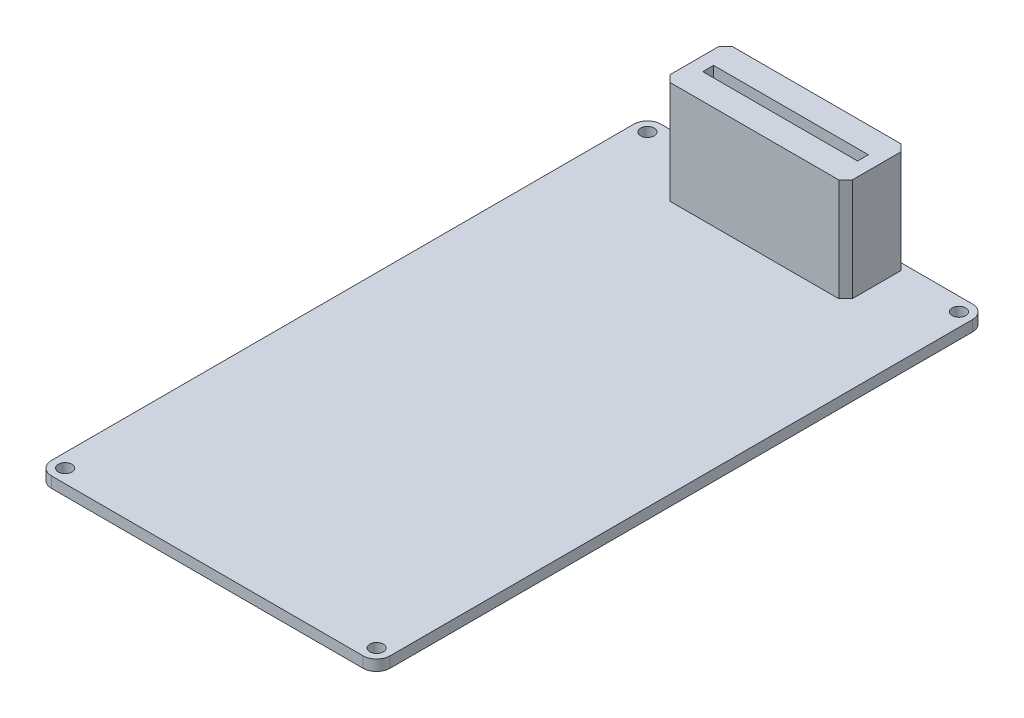
ISO-10303-21;
HEADER;
FILE_DESCRIPTION(('STEP AP214'),'2;1');
FILE_NAME('part.step','',(''),(''),'','','');
FILE_SCHEMA(('AUTOMOTIVE_DESIGN { 1 0 10303 214 1 1 1 1 }'));
ENDSEC;
DATA;
#1=APPLICATION_CONTEXT('core data for automotive mechanical design processes');
#2=APPLICATION_PROTOCOL_DEFINITION('international standard','automotive_design',2000,#1);
#3=PRODUCT_CONTEXT('',#1,'mechanical');
#4=PRODUCT('Part','Part','',(#3));
#5=PRODUCT_RELATED_PRODUCT_CATEGORY('part','',(#4));
#6=PRODUCT_DEFINITION_FORMATION('','',#4);
#7=PRODUCT_DEFINITION_CONTEXT('part definition',#1,'design');
#8=PRODUCT_DEFINITION('design','',#6,#7);
#9=PRODUCT_DEFINITION_SHAPE('','',#8);
#10=(LENGTH_UNIT() NAMED_UNIT(*) SI_UNIT(.MILLI.,.METRE.));
#11=(NAMED_UNIT(*) PLANE_ANGLE_UNIT() SI_UNIT($,.RADIAN.));
#12=(NAMED_UNIT(*) SI_UNIT($,.STERADIAN.) SOLID_ANGLE_UNIT());
#13=UNCERTAINTY_MEASURE_WITH_UNIT(LENGTH_MEASURE(1.E-05),#10,'distance_accuracy_value','');
#14=(GEOMETRIC_REPRESENTATION_CONTEXT(3) GLOBAL_UNCERTAINTY_ASSIGNED_CONTEXT((#13)) GLOBAL_UNIT_ASSIGNED_CONTEXT((#10,
#11,#12)) REPRESENTATION_CONTEXT('',''));
#15=CARTESIAN_POINT('',(0.,0.,0.));
#16=DIRECTION('',(0.,0.,1.));
#17=DIRECTION('',(1.,0.,0.));
#18=AXIS2_PLACEMENT_3D('',#15,#16,#17);
#19=CARTESIAN_POINT('',(-23.,1.6,-45.));
#20=DIRECTION('',(0.,0.,1.));
#21=DIRECTION('',(1.,0.,0.));
#22=AXIS2_PLACEMENT_3D('',#19,#20,#21);
#23=PLANE('',#22);
#24=DIRECTION('',(0.,-1.,0.));
#25=VECTOR('',#24,1.);
#26=CARTESIAN_POINT('',(-23.,1.6,-45.));
#27=LINE('',#26,#25);
#28=CARTESIAN_POINT('',(-23.,1.6,-45.));
#29=VERTEX_POINT('',#28);
#30=CARTESIAN_POINT('',(-23.,0.,-45.));
#31=VERTEX_POINT('',#30);
#32=EDGE_CURVE('E267',#29,#31,#27,.T.);
#33=ORIENTED_EDGE('',*,*,#32,.F.);
#34=DIRECTION('',(-1.,0.,0.));
#35=VECTOR('',#34,1.);
#36=CARTESIAN_POINT('',(-23.,1.6,-45.));
#37=LINE('',#36,#35);
#38=CARTESIAN_POINT('',(23.,1.6,-45.));
#39=VERTEX_POINT('',#38);
#40=EDGE_CURVE('E265',#39,#29,#37,.T.);
#41=ORIENTED_EDGE('',*,*,#40,.F.);
#42=DIRECTION('',(0.,-1.,0.));
#43=VECTOR('',#42,1.);
#44=CARTESIAN_POINT('',(23.,1.6,-45.));
#45=LINE('',#44,#43);
#46=CARTESIAN_POINT('',(23.,0.,-45.));
#47=VERTEX_POINT('',#46);
#48=EDGE_CURVE('E285',#39,#47,#45,.T.);
#49=ORIENTED_EDGE('',*,*,#48,.T.);
#50=DIRECTION('',(-1.,0.,0.));
#51=VECTOR('',#50,1.);
#52=CARTESIAN_POINT('',(-23.,0.,-45.));
#53=LINE('',#52,#51);
#54=EDGE_CURVE('E253',#47,#31,#53,.T.);
#55=ORIENTED_EDGE('',*,*,#54,.T.);
#56=EDGE_LOOP('',(#33,#41,#49,#55));
#57=FACE_BOUND('',#56,.T.);
#58=ADVANCED_FACE('F38',(#57),#23,.F.);
#59=DIRECTION('',(-1.,0.,0.));
#60=VECTOR('',#59,1.);
#61=CARTESIAN_POINT('',(-23.,2.6,-45.));
#62=LINE('',#61,#60);
#63=CARTESIAN_POINT('',(12.46,2.6,-45.));
#64=VERTEX_POINT('',#63);
#65=CARTESIAN_POINT('',(-12.46,2.6,-45.));
#66=VERTEX_POINT('',#65);
#67=EDGE_CURVE('E318',#64,#66,#62,.T.);
#68=ORIENTED_EDGE('',*,*,#67,.T.);
#69=DIRECTION('',(0.,-1.,0.));
#70=VECTOR('',#69,1.);
#71=CARTESIAN_POINT('',(-12.46,18.2142135623731,-45.));
#72=LINE('',#71,#70);
#73=CARTESIAN_POINT('',(-12.46,16.8,-45.));
#74=VERTEX_POINT('',#73);
#75=EDGE_CURVE('E399',#74,#66,#72,.T.);
#76=ORIENTED_EDGE('',*,*,#75,.F.);
#77=DIRECTION('',(1.,0.,0.));
#78=VECTOR('',#77,1.);
#79=CARTESIAN_POINT('',(-23.,16.8,-45.));
#80=LINE('',#79,#78);
#81=CARTESIAN_POINT('',(12.46,16.8,-45.));
#82=VERTEX_POINT('',#81);
#83=EDGE_CURVE('E363',#74,#82,#80,.T.);
#84=ORIENTED_EDGE('',*,*,#83,.T.);
#85=DIRECTION('',(0.,-1.,0.));
#86=VECTOR('',#85,1.);
#87=CARTESIAN_POINT('',(12.46,18.2142135623731,-45.));
#88=LINE('',#87,#86);
#89=EDGE_CURVE('E197',#82,#64,#88,.T.);
#90=ORIENTED_EDGE('',*,*,#89,.T.);
#91=EDGE_LOOP('',(#68,#76,#84,#90));
#92=FACE_BOUND('',#91,.T.);
#93=ADVANCED_FACE('F404',(#92),#23,.F.);
#94=CARTESIAN_POINT('',(13.46,16.8,-43.));
#95=DIRECTION('',(1.,0.,0.));
#96=DIRECTION('',(0.,0.,-1.));
#97=AXIS2_PLACEMENT_3D('',#94,#95,#96);
#98=PLANE('',#97);
#99=DIRECTION('',(0.,-1.,0.));
#100=VECTOR('',#99,1.);
#101=CARTESIAN_POINT('',(13.46,18.2142135623731,-44.));
#102=LINE('',#101,#100);
#103=CARTESIAN_POINT('',(13.46,16.8,-44.));
#104=VERTEX_POINT('',#103);
#105=CARTESIAN_POINT('',(13.46,1.6,-44.));
#106=VERTEX_POINT('',#105);
#107=EDGE_CURVE('E186',#104,#106,#102,.T.);
#108=ORIENTED_EDGE('',*,*,#107,.F.);
#109=DIRECTION('',(0.,0.,1.));
#110=VECTOR('',#109,1.);
#111=CARTESIAN_POINT('',(13.46,16.8,-43.));
#112=LINE('',#111,#110);
#113=CARTESIAN_POINT('',(13.46,16.8,-36.8));
#114=VERTEX_POINT('',#113);
#115=EDGE_CURVE('E230',#104,#114,#112,.T.);
#116=ORIENTED_EDGE('',*,*,#115,.T.);
#117=DIRECTION('',(0.,-1.,0.));
#118=VECTOR('',#117,1.);
#119=CARTESIAN_POINT('',(13.46,18.2142135623731,-36.8));
#120=LINE('',#119,#118);
#121=CARTESIAN_POINT('',(13.46,1.6,-36.8));
#122=VERTEX_POINT('',#121);
#123=EDGE_CURVE('E53',#114,#122,#120,.T.);
#124=ORIENTED_EDGE('',*,*,#123,.T.);
#125=DIRECTION('',(0.,0.,1.));
#126=VECTOR('',#125,1.);
#127=CARTESIAN_POINT('',(13.46,1.6,-43.));
#128=LINE('',#127,#126);
#129=EDGE_CURVE('E206',#106,#122,#128,.T.);
#130=ORIENTED_EDGE('',*,*,#129,.F.);
#131=EDGE_LOOP('',(#108,#116,#124,#130));
#132=FACE_BOUND('',#131,.T.);
#133=ADVANCED_FACE('F211',(#132),#98,.T.);
#134=CARTESIAN_POINT('',(-13.46,16.8,-43.));
#135=DIRECTION('',(-1.,0.,0.));
#136=DIRECTION('',(0.,0.,1.));
#137=AXIS2_PLACEMENT_3D('',#134,#135,#136);
#138=PLANE('',#137);
#139=DIRECTION('',(0.,-1.,0.));
#140=VECTOR('',#139,1.);
#141=CARTESIAN_POINT('',(-13.46,18.2142135623731,-36.8));
#142=LINE('',#141,#140);
#143=CARTESIAN_POINT('',(-13.46,16.8,-36.8));
#144=VERTEX_POINT('',#143);
#145=CARTESIAN_POINT('',(-13.46,1.6,-36.8));
#146=VERTEX_POINT('',#145);
#147=EDGE_CURVE('E377',#144,#146,#142,.T.);
#148=ORIENTED_EDGE('',*,*,#147,.F.);
#149=DIRECTION('',(0.,0.,-1.));
#150=VECTOR('',#149,1.);
#151=CARTESIAN_POINT('',(-13.46,16.8,-43.));
#152=LINE('',#151,#150);
#153=CARTESIAN_POINT('',(-13.46,16.8,-44.));
#154=VERTEX_POINT('',#153);
#155=EDGE_CURVE('E216',#144,#154,#152,.T.);
#156=ORIENTED_EDGE('',*,*,#155,.T.);
#157=DIRECTION('',(0.,-1.,0.));
#158=VECTOR('',#157,1.);
#159=CARTESIAN_POINT('',(-13.46,18.2142135623731,-44.));
#160=LINE('',#159,#158);
#161=CARTESIAN_POINT('',(-13.46,1.6,-44.));
#162=VERTEX_POINT('',#161);
#163=EDGE_CURVE('E396',#154,#162,#160,.T.);
#164=ORIENTED_EDGE('',*,*,#163,.T.);
#165=DIRECTION('',(0.,0.,-1.));
#166=VECTOR('',#165,1.);
#167=CARTESIAN_POINT('',(-13.46,1.6,-43.));
#168=LINE('',#167,#166);
#169=EDGE_CURVE('E213',#146,#162,#168,.T.);
#170=ORIENTED_EDGE('',*,*,#169,.F.);
#171=EDGE_LOOP('',(#148,#156,#164,#170));
#172=FACE_BOUND('',#171,.T.);
#173=ADVANCED_FACE('F394',(#172),#138,.T.);
#174=CARTESIAN_POINT('',(-23.,1.6,-43.));
#175=DIRECTION('',(0.,1.,0.));
#176=DIRECTION('',(0.,0.,1.));
#177=AXIS2_PLACEMENT_3D('',#174,#175,#176);
#178=PLANE('',#177);
#179=DIRECTION('',(0.707106781186548,0.,0.707106781186548));
#180=VECTOR('',#179,1.);
#181=CARTESIAN_POINT('',(-21.33,1.6,-44.67));
#182=LINE('',#181,#180);
#183=CARTESIAN_POINT('',(-12.46,1.6,-35.8));
#184=VERTEX_POINT('',#183);
#185=EDGE_CURVE('E368',#146,#184,#182,.T.);
#186=ORIENTED_EDGE('',*,*,#185,.F.);
#187=ORIENTED_EDGE('',*,*,#169,.T.);
#188=DIRECTION('',(-0.707106781186549,0.,0.707106781186546));
#189=VECTOR('',#188,1.);
#190=CARTESIAN_POINT('',(-18.73,1.6,-38.73));
#191=LINE('',#190,#189);
#192=CARTESIAN_POINT('',(-12.56,1.6,-44.9));
#193=VERTEX_POINT('',#192);
#194=EDGE_CURVE('E379',#193,#162,#191,.T.);
#195=ORIENTED_EDGE('',*,*,#194,.F.);
#196=DIRECTION('',(1.,0.,0.));
#197=VECTOR('',#196,1.);
#198=CARTESIAN_POINT('',(-23.,1.6,-44.9));
#199=LINE('',#198,#197);
#200=CARTESIAN_POINT('',(12.56,1.6,-44.9));
#201=VERTEX_POINT('',#200);
#202=EDGE_CURVE('E208',#193,#201,#199,.T.);
#203=ORIENTED_EDGE('',*,*,#202,.T.);
#204=DIRECTION('',(-0.707106781186548,0.,-0.707106781186548));
#205=VECTOR('',#204,1.);
#206=CARTESIAN_POINT('',(-4.27,1.6,-61.73));
#207=LINE('',#206,#205);
#208=EDGE_CURVE('E189',#106,#201,#207,.T.);
#209=ORIENTED_EDGE('',*,*,#208,.F.);
#210=ORIENTED_EDGE('',*,*,#129,.T.);
#211=DIRECTION('',(0.707106781186547,0.,-0.707106781186548));
#212=VECTOR('',#211,1.);
#213=CARTESIAN_POINT('',(-1.66999999999997,1.6,-21.67));
#214=LINE('',#213,#212);
#215=CARTESIAN_POINT('',(12.46,1.6,-35.8));
#216=VERTEX_POINT('',#215);
#217=EDGE_CURVE('E370',#216,#122,#214,.T.);
#218=ORIENTED_EDGE('',*,*,#217,.F.);
#219=DIRECTION('',(-1.,0.,0.));
#220=VECTOR('',#219,1.);
#221=CARTESIAN_POINT('',(-23.,1.6,-35.8));
#222=LINE('',#221,#220);
#223=EDGE_CURVE('E219',#216,#184,#222,.T.);
#224=ORIENTED_EDGE('',*,*,#223,.T.);
#225=EDGE_LOOP('',(#186,#187,#195,#203,#209,#210,#218,#224));
#226=FACE_BOUND('',#225,.T.);
#227=ORIENTED_EDGE('',*,*,#40,.T.);
#228=CARTESIAN_POINT('',(-23.,1.6,-43.));
#229=DIRECTION('',(0.,1.,0.));
#230=DIRECTION('',(0.,0.,1.));
#231=AXIS2_PLACEMENT_3D('',#228,#229,#230);
#232=CIRCLE('',#231,2.);
#233=CARTESIAN_POINT('',(-25.,1.6,-43.));
#234=VERTEX_POINT('',#233);
#235=EDGE_CURVE('E249',#29,#234,#232,.T.);
#236=ORIENTED_EDGE('',*,*,#235,.T.);
#237=DIRECTION('',(0.,0.,1.));
#238=VECTOR('',#237,1.);
#239=CARTESIAN_POINT('',(-25.,1.6,43.));
#240=LINE('',#239,#238);
#241=CARTESIAN_POINT('',(-25.,1.6,43.));
#242=VERTEX_POINT('',#241);
#243=EDGE_CURVE('E252',#234,#242,#240,.T.);
#244=ORIENTED_EDGE('',*,*,#243,.T.);
#245=CARTESIAN_POINT('',(-23.,1.6,43.));
#246=DIRECTION('',(0.,1.,0.));
#247=DIRECTION('',(0.,0.,1.));
#248=AXIS2_PLACEMENT_3D('',#245,#246,#247);
#249=CIRCLE('',#248,2.);
#250=CARTESIAN_POINT('',(-23.,1.6,45.));
#251=VERTEX_POINT('',#250);
#252=EDGE_CURVE('E255',#242,#251,#249,.T.);
#253=ORIENTED_EDGE('',*,*,#252,.T.);
#254=DIRECTION('',(1.,0.,0.));
#255=VECTOR('',#254,1.);
#256=CARTESIAN_POINT('',(-23.,1.6,45.));
#257=LINE('',#256,#255);
#258=CARTESIAN_POINT('',(23.,1.6,45.));
#259=VERTEX_POINT('',#258);
#260=EDGE_CURVE('E257',#251,#259,#257,.T.);
#261=ORIENTED_EDGE('',*,*,#260,.T.);
#262=CARTESIAN_POINT('',(23.,1.6,43.));
#263=DIRECTION('',(0.,1.,0.));
#264=DIRECTION('',(0.,0.,1.));
#265=AXIS2_PLACEMENT_3D('',#262,#263,#264);
#266=CIRCLE('',#265,2.);
#267=CARTESIAN_POINT('',(25.,1.6,43.));
#268=VERTEX_POINT('',#267);
#269=EDGE_CURVE('E259',#259,#268,#266,.T.);
#270=ORIENTED_EDGE('',*,*,#269,.T.);
#271=DIRECTION('',(0.,0.,-1.));
#272=VECTOR('',#271,1.);
#273=CARTESIAN_POINT('',(25.,1.6,-43.));
#274=LINE('',#273,#272);
#275=CARTESIAN_POINT('',(25.,1.6,-43.));
#276=VERTEX_POINT('',#275);
#277=EDGE_CURVE('E261',#268,#276,#274,.T.);
#278=ORIENTED_EDGE('',*,*,#277,.T.);
#279=CARTESIAN_POINT('',(23.,1.6,-43.));
#280=DIRECTION('',(0.,1.,0.));
#281=DIRECTION('',(0.,0.,1.));
#282=AXIS2_PLACEMENT_3D('',#279,#280,#281);
#283=CIRCLE('',#282,2.);
#284=EDGE_CURVE('E263',#276,#39,#283,.T.);
#285=ORIENTED_EDGE('',*,*,#284,.T.);
#286=EDGE_LOOP('',(#227,#236,#244,#253,#261,#270,#278,#285));
#287=FACE_BOUND('',#286,.T.);
#288=CARTESIAN_POINT('',(-23.,1.6,43.));
#289=DIRECTION('',(0.,1.,0.));
#290=DIRECTION('',(0.,0.,1.));
#291=AXIS2_PLACEMENT_3D('',#288,#289,#290);
#292=CIRCLE('',#291,1.);
#293=CARTESIAN_POINT('',(-23.,1.6,44.));
#294=VERTEX_POINT('',#293);
#295=EDGE_CURVE('E231',#294,#294,#292,.T.);
#296=ORIENTED_EDGE('',*,*,#295,.F.);
#297=EDGE_LOOP('',(#296));
#298=FACE_BOUND('',#297,.T.);
#299=CARTESIAN_POINT('',(-23.,1.6,-43.));
#300=DIRECTION('',(0.,1.,0.));
#301=DIRECTION('',(0.,0.,1.));
#302=AXIS2_PLACEMENT_3D('',#299,#300,#301);
#303=CIRCLE('',#302,1.);
#304=CARTESIAN_POINT('',(-23.,1.6,-42.));
#305=VERTEX_POINT('',#304);
#306=EDGE_CURVE('E243',#305,#305,#303,.T.);
#307=ORIENTED_EDGE('',*,*,#306,.F.);
#308=EDGE_LOOP('',(#307));
#309=FACE_BOUND('',#308,.T.);
#310=CARTESIAN_POINT('',(23.,1.6,-43.));
#311=DIRECTION('',(0.,1.,0.));
#312=DIRECTION('',(0.,0.,1.));
#313=AXIS2_PLACEMENT_3D('',#310,#311,#312);
#314=CIRCLE('',#313,1.);
#315=CARTESIAN_POINT('',(23.,1.6,-42.));
#316=VERTEX_POINT('',#315);
#317=EDGE_CURVE('E237',#316,#316,#314,.T.);
#318=ORIENTED_EDGE('',*,*,#317,.F.);
#319=EDGE_LOOP('',(#318));
#320=FACE_BOUND('',#319,.T.);
#321=CARTESIAN_POINT('',(23.,1.6,43.));
#322=DIRECTION('',(0.,1.,0.));
#323=DIRECTION('',(0.,0.,1.));
#324=AXIS2_PLACEMENT_3D('',#321,#322,#323);
#325=CIRCLE('',#324,1.);
#326=CARTESIAN_POINT('',(23.,1.6,44.));
#327=VERTEX_POINT('',#326);
#328=EDGE_CURVE('E223',#327,#327,#325,.T.);
#329=ORIENTED_EDGE('',*,*,#328,.F.);
#330=EDGE_LOOP('',(#329));
#331=FACE_BOUND('',#330,.T.);
#332=ADVANCED_FACE('F203',(#226,#287,#298,#309,#320,#331),#178,.T.);
#333=CARTESIAN_POINT('',(-23.,0.,-43.));
#334=DIRECTION('',(0.,1.,0.));
#335=DIRECTION('',(0.,0.,1.));
#336=AXIS2_PLACEMENT_3D('',#333,#334,#335);
#337=PLANE('',#336);
#338=CARTESIAN_POINT('',(-23.,0.,-43.));
#339=DIRECTION('',(0.,1.,0.));
#340=DIRECTION('',(0.,0.,1.));
#341=AXIS2_PLACEMENT_3D('',#338,#339,#340);
#342=CIRCLE('',#341,2.);
#343=CARTESIAN_POINT('',(-25.,0.,-43.));
#344=VERTEX_POINT('',#343);
#345=EDGE_CURVE('E246',#31,#344,#342,.T.);
#346=ORIENTED_EDGE('',*,*,#345,.F.);
#347=ORIENTED_EDGE('',*,*,#54,.F.);
#348=CARTESIAN_POINT('',(23.,0.,-43.));
#349=DIRECTION('',(0.,1.,0.));
#350=DIRECTION('',(0.,0.,1.));
#351=AXIS2_PLACEMENT_3D('',#348,#349,#350);
#352=CIRCLE('',#351,2.);
#353=CARTESIAN_POINT('',(25.,0.,-43.));
#354=VERTEX_POINT('',#353);
#355=EDGE_CURVE('E280',#354,#47,#352,.T.);
#356=ORIENTED_EDGE('',*,*,#355,.F.);
#357=DIRECTION('',(0.,0.,-1.));
#358=VECTOR('',#357,1.);
#359=CARTESIAN_POINT('',(25.,0.,-43.));
#360=LINE('',#359,#358);
#361=CARTESIAN_POINT('',(25.,0.,43.));
#362=VERTEX_POINT('',#361);
#363=EDGE_CURVE('E278',#362,#354,#360,.T.);
#364=ORIENTED_EDGE('',*,*,#363,.F.);
#365=CARTESIAN_POINT('',(23.,0.,43.));
#366=DIRECTION('',(0.,1.,0.));
#367=DIRECTION('',(0.,0.,1.));
#368=AXIS2_PLACEMENT_3D('',#365,#366,#367);
#369=CIRCLE('',#368,2.);
#370=CARTESIAN_POINT('',(23.,0.,45.));
#371=VERTEX_POINT('',#370);
#372=EDGE_CURVE('E276',#371,#362,#369,.T.);
#373=ORIENTED_EDGE('',*,*,#372,.F.);
#374=DIRECTION('',(1.,0.,0.));
#375=VECTOR('',#374,1.);
#376=CARTESIAN_POINT('',(-23.,0.,45.));
#377=LINE('',#376,#375);
#378=CARTESIAN_POINT('',(-23.,0.,45.));
#379=VERTEX_POINT('',#378);
#380=EDGE_CURVE('E274',#379,#371,#377,.T.);
#381=ORIENTED_EDGE('',*,*,#380,.F.);
#382=CARTESIAN_POINT('',(-23.,0.,43.));
#383=DIRECTION('',(0.,1.,0.));
#384=DIRECTION('',(0.,0.,1.));
#385=AXIS2_PLACEMENT_3D('',#382,#383,#384);
#386=CIRCLE('',#385,2.);
#387=CARTESIAN_POINT('',(-25.,0.,43.));
#388=VERTEX_POINT('',#387);
#389=EDGE_CURVE('E272',#388,#379,#386,.T.);
#390=ORIENTED_EDGE('',*,*,#389,.F.);
#391=DIRECTION('',(0.,0.,1.));
#392=VECTOR('',#391,1.);
#393=CARTESIAN_POINT('',(-25.,0.,43.));
#394=LINE('',#393,#392);
#395=EDGE_CURVE('E270',#344,#388,#394,.T.);
#396=ORIENTED_EDGE('',*,*,#395,.F.);
#397=EDGE_LOOP('',(#346,#347,#356,#364,#373,#381,#390,#396));
#398=FACE_BOUND('',#397,.T.);
#399=CARTESIAN_POINT('',(-23.,0.,-43.));
#400=DIRECTION('',(0.,1.,0.));
#401=DIRECTION('',(0.,0.,1.));
#402=AXIS2_PLACEMENT_3D('',#399,#400,#401);
#403=CIRCLE('',#402,1.);
#404=CARTESIAN_POINT('',(-23.,0.,-42.));
#405=VERTEX_POINT('',#404);
#406=EDGE_CURVE('E240',#405,#405,#403,.T.);
#407=ORIENTED_EDGE('',*,*,#406,.T.);
#408=EDGE_LOOP('',(#407));
#409=FACE_BOUND('',#408,.T.);
#410=CARTESIAN_POINT('',(23.,0.,-43.));
#411=DIRECTION('',(0.,1.,0.));
#412=DIRECTION('',(0.,0.,1.));
#413=AXIS2_PLACEMENT_3D('',#410,#411,#412);
#414=CIRCLE('',#413,1.);
#415=CARTESIAN_POINT('',(23.,0.,-42.));
#416=VERTEX_POINT('',#415);
#417=EDGE_CURVE('E234',#416,#416,#414,.T.);
#418=ORIENTED_EDGE('',*,*,#417,.T.);
#419=EDGE_LOOP('',(#418));
#420=FACE_BOUND('',#419,.T.);
#421=CARTESIAN_POINT('',(-23.,0.,43.));
#422=DIRECTION('',(0.,1.,0.));
#423=DIRECTION('',(0.,0.,1.));
#424=AXIS2_PLACEMENT_3D('',#421,#422,#423);
#425=CIRCLE('',#424,1.);
#426=CARTESIAN_POINT('',(-23.,0.,44.));
#427=VERTEX_POINT('',#426);
#428=EDGE_CURVE('E226',#427,#427,#425,.T.);
#429=ORIENTED_EDGE('',*,*,#428,.T.);
#430=EDGE_LOOP('',(#429));
#431=FACE_BOUND('',#430,.T.);
#432=CARTESIAN_POINT('',(23.,0.,43.));
#433=DIRECTION('',(0.,1.,0.));
#434=DIRECTION('',(0.,0.,1.));
#435=AXIS2_PLACEMENT_3D('',#432,#433,#434);
#436=CIRCLE('',#435,1.);
#437=CARTESIAN_POINT('',(23.,0.,44.));
#438=VERTEX_POINT('',#437);
#439=EDGE_CURVE('E227',#438,#438,#436,.T.);
#440=ORIENTED_EDGE('',*,*,#439,.T.);
#441=EDGE_LOOP('',(#440));
#442=FACE_BOUND('',#441,.T.);
#443=ADVANCED_FACE('F420',(#398,#409,#420,#431,#442),#337,.F.);
#444=CARTESIAN_POINT('',(-23.,1.6,-43.));
#445=DIRECTION('',(0.,-1.,0.));
#446=DIRECTION('',(0.,0.,-1.));
#447=AXIS2_PLACEMENT_3D('',#444,#445,#446);
#448=CYLINDRICAL_SURFACE('',#447,2.);
#449=ORIENTED_EDGE('',*,*,#345,.T.);
#450=DIRECTION('',(0.,-1.,0.));
#451=VECTOR('',#450,1.);
#452=CARTESIAN_POINT('',(-25.,1.6,-43.));
#453=LINE('',#452,#451);
#454=EDGE_CURVE('E303',#234,#344,#453,.T.);
#455=ORIENTED_EDGE('',*,*,#454,.F.);
#456=ORIENTED_EDGE('',*,*,#235,.F.);
#457=ORIENTED_EDGE('',*,*,#32,.T.);
#458=EDGE_LOOP('',(#449,#455,#456,#457));
#459=FACE_BOUND('',#458,.T.);
#460=ADVANCED_FACE('F40',(#459),#448,.T.);
#461=CARTESIAN_POINT('',(-25.,1.6,43.));
#462=DIRECTION('',(1.,0.,0.));
#463=DIRECTION('',(0.,0.,-1.));
#464=AXIS2_PLACEMENT_3D('',#461,#462,#463);
#465=PLANE('',#464);
#466=ORIENTED_EDGE('',*,*,#395,.T.);
#467=DIRECTION('',(0.,-1.,0.));
#468=VECTOR('',#467,1.);
#469=CARTESIAN_POINT('',(-25.,1.6,43.));
#470=LINE('',#469,#468);
#471=EDGE_CURVE('E300',#242,#388,#470,.T.);
#472=ORIENTED_EDGE('',*,*,#471,.F.);
#473=ORIENTED_EDGE('',*,*,#243,.F.);
#474=ORIENTED_EDGE('',*,*,#454,.T.);
#475=EDGE_LOOP('',(#466,#472,#473,#474));
#476=FACE_BOUND('',#475,.T.);
#477=ADVANCED_FACE('F441',(#476),#465,.F.);
#478=CARTESIAN_POINT('',(-23.,1.6,43.));
#479=DIRECTION('',(0.,-1.,0.));
#480=DIRECTION('',(0.,0.,-1.));
#481=AXIS2_PLACEMENT_3D('',#478,#479,#480);
#482=CYLINDRICAL_SURFACE('',#481,2.);
#483=ORIENTED_EDGE('',*,*,#389,.T.);
#484=DIRECTION('',(0.,-1.,0.));
#485=VECTOR('',#484,1.);
#486=CARTESIAN_POINT('',(-23.,1.6,45.));
#487=LINE('',#486,#485);
#488=EDGE_CURVE('E297',#251,#379,#487,.T.);
#489=ORIENTED_EDGE('',*,*,#488,.F.);
#490=ORIENTED_EDGE('',*,*,#252,.F.);
#491=ORIENTED_EDGE('',*,*,#471,.T.);
#492=EDGE_LOOP('',(#483,#489,#490,#491));
#493=FACE_BOUND('',#492,.T.);
#494=ADVANCED_FACE('F438',(#493),#482,.T.);
#495=CARTESIAN_POINT('',(-23.,1.6,45.));
#496=DIRECTION('',(0.,0.,-1.));
#497=DIRECTION('',(-1.,0.,0.));
#498=AXIS2_PLACEMENT_3D('',#495,#496,#497);
#499=PLANE('',#498);
#500=ORIENTED_EDGE('',*,*,#380,.T.);
#501=DIRECTION('',(0.,-1.,0.));
#502=VECTOR('',#501,1.);
#503=CARTESIAN_POINT('',(23.,1.6,45.));
#504=LINE('',#503,#502);
#505=EDGE_CURVE('E294',#259,#371,#504,.T.);
#506=ORIENTED_EDGE('',*,*,#505,.F.);
#507=ORIENTED_EDGE('',*,*,#260,.F.);
#508=ORIENTED_EDGE('',*,*,#488,.T.);
#509=EDGE_LOOP('',(#500,#506,#507,#508));
#510=FACE_BOUND('',#509,.T.);
#511=ADVANCED_FACE('F434',(#510),#499,.F.);
#512=CARTESIAN_POINT('',(23.,1.6,43.));
#513=DIRECTION('',(0.,-1.,0.));
#514=DIRECTION('',(0.,0.,-1.));
#515=AXIS2_PLACEMENT_3D('',#512,#513,#514);
#516=CYLINDRICAL_SURFACE('',#515,2.);
#517=ORIENTED_EDGE('',*,*,#372,.T.);
#518=DIRECTION('',(0.,-1.,0.));
#519=VECTOR('',#518,1.);
#520=CARTESIAN_POINT('',(25.,1.6,43.));
#521=LINE('',#520,#519);
#522=EDGE_CURVE('E291',#268,#362,#521,.T.);
#523=ORIENTED_EDGE('',*,*,#522,.F.);
#524=ORIENTED_EDGE('',*,*,#269,.F.);
#525=ORIENTED_EDGE('',*,*,#505,.T.);
#526=EDGE_LOOP('',(#517,#523,#524,#525));
#527=FACE_BOUND('',#526,.T.);
#528=ADVANCED_FACE('F430',(#527),#516,.T.);
#529=CARTESIAN_POINT('',(25.,1.6,-43.));
#530=DIRECTION('',(-1.,0.,0.));
#531=DIRECTION('',(0.,0.,1.));
#532=AXIS2_PLACEMENT_3D('',#529,#530,#531);
#533=PLANE('',#532);
#534=ORIENTED_EDGE('',*,*,#363,.T.);
#535=DIRECTION('',(0.,-1.,0.));
#536=VECTOR('',#535,1.);
#537=CARTESIAN_POINT('',(25.,1.6,-43.));
#538=LINE('',#537,#536);
#539=EDGE_CURVE('E288',#276,#354,#538,.T.);
#540=ORIENTED_EDGE('',*,*,#539,.F.);
#541=ORIENTED_EDGE('',*,*,#277,.F.);
#542=ORIENTED_EDGE('',*,*,#522,.T.);
#543=EDGE_LOOP('',(#534,#540,#541,#542));
#544=FACE_BOUND('',#543,.T.);
#545=ADVANCED_FACE('F426',(#544),#533,.F.);
#546=CARTESIAN_POINT('',(23.,1.6,-43.));
#547=DIRECTION('',(0.,-1.,0.));
#548=DIRECTION('',(0.,0.,-1.));
#549=AXIS2_PLACEMENT_3D('',#546,#547,#548);
#550=CYLINDRICAL_SURFACE('',#549,2.);
#551=ORIENTED_EDGE('',*,*,#355,.T.);
#552=ORIENTED_EDGE('',*,*,#48,.F.);
#553=ORIENTED_EDGE('',*,*,#284,.F.);
#554=ORIENTED_EDGE('',*,*,#539,.T.);
#555=EDGE_LOOP('',(#551,#552,#553,#554));
#556=FACE_BOUND('',#555,.T.);
#557=ADVANCED_FACE('F422',(#556),#550,.T.);
#558=CARTESIAN_POINT('',(-23.,1.6,-43.));
#559=DIRECTION('',(0.,-1.,0.));
#560=DIRECTION('',(0.,0.,-1.));
#561=AXIS2_PLACEMENT_3D('',#558,#559,#560);
#562=CYLINDRICAL_SURFACE('',#561,1.);
#563=ORIENTED_EDGE('',*,*,#306,.T.);
#564=EDGE_LOOP('',(#563));
#565=FACE_BOUND('',#564,.T.);
#566=ORIENTED_EDGE('',*,*,#406,.F.);
#567=EDGE_LOOP('',(#566));
#568=FACE_BOUND('',#567,.T.);
#569=ADVANCED_FACE('F425',(#565,#568),#562,.F.);
#570=CARTESIAN_POINT('',(23.,1.6,-43.));
#571=DIRECTION('',(0.,-1.,0.));
#572=DIRECTION('',(0.,0.,-1.));
#573=AXIS2_PLACEMENT_3D('',#570,#571,#572);
#574=CYLINDRICAL_SURFACE('',#573,1.);
#575=ORIENTED_EDGE('',*,*,#317,.T.);
#576=EDGE_LOOP('',(#575));
#577=FACE_BOUND('',#576,.T.);
#578=ORIENTED_EDGE('',*,*,#417,.F.);
#579=EDGE_LOOP('',(#578));
#580=FACE_BOUND('',#579,.T.);
#581=ADVANCED_FACE('F543',(#577,#580),#574,.F.);
#582=CARTESIAN_POINT('',(-23.,1.6,43.));
#583=DIRECTION('',(0.,-1.,0.));
#584=DIRECTION('',(0.,0.,-1.));
#585=AXIS2_PLACEMENT_3D('',#582,#583,#584);
#586=CYLINDRICAL_SURFACE('',#585,1.);
#587=ORIENTED_EDGE('',*,*,#295,.T.);
#588=EDGE_LOOP('',(#587));
#589=FACE_BOUND('',#588,.T.);
#590=ORIENTED_EDGE('',*,*,#428,.F.);
#591=EDGE_LOOP('',(#590));
#592=FACE_BOUND('',#591,.T.);
#593=ADVANCED_FACE('F486',(#589,#592),#586,.F.);
#594=CARTESIAN_POINT('',(23.,1.6,43.));
#595=DIRECTION('',(0.,-1.,0.));
#596=DIRECTION('',(0.,0.,-1.));
#597=AXIS2_PLACEMENT_3D('',#594,#595,#596);
#598=CYLINDRICAL_SURFACE('',#597,1.);
#599=ORIENTED_EDGE('',*,*,#328,.T.);
#600=EDGE_LOOP('',(#599));
#601=FACE_BOUND('',#600,.T.);
#602=ORIENTED_EDGE('',*,*,#439,.F.);
#603=EDGE_LOOP('',(#602));
#604=FACE_BOUND('',#603,.T.);
#605=ADVANCED_FACE('F483',(#601,#604),#598,.F.);
#606=CARTESIAN_POINT('',(-23.,16.8,-35.8));
#607=DIRECTION('',(0.,0.,1.));
#608=DIRECTION('',(1.,0.,0.));
#609=AXIS2_PLACEMENT_3D('',#606,#607,#608);
#610=PLANE('',#609);
#611=DIRECTION('',(0.,-1.,0.));
#612=VECTOR('',#611,1.);
#613=CARTESIAN_POINT('',(-12.46,18.2142135623731,-35.8));
#614=LINE('',#613,#612);
#615=CARTESIAN_POINT('',(-12.46,16.8,-35.8));
#616=VERTEX_POINT('',#615);
#617=EDGE_CURVE('E61',#616,#184,#614,.T.);
#618=ORIENTED_EDGE('',*,*,#617,.T.);
#619=ORIENTED_EDGE('',*,*,#223,.F.);
#620=DIRECTION('',(0.,-1.,0.));
#621=VECTOR('',#620,1.);
#622=CARTESIAN_POINT('',(12.46,18.2142135623731,-35.8));
#623=LINE('',#622,#621);
#624=CARTESIAN_POINT('',(12.46,16.8,-35.8));
#625=VERTEX_POINT('',#624);
#626=EDGE_CURVE('E374',#625,#216,#623,.T.);
#627=ORIENTED_EDGE('',*,*,#626,.F.);
#628=DIRECTION('',(-1.,0.,0.));
#629=VECTOR('',#628,1.);
#630=CARTESIAN_POINT('',(-23.,16.8,-35.8));
#631=LINE('',#630,#629);
#632=EDGE_CURVE('E212',#625,#616,#631,.T.);
#633=ORIENTED_EDGE('',*,*,#632,.T.);
#634=EDGE_LOOP('',(#618,#619,#627,#633));
#635=FACE_BOUND('',#634,.T.);
#636=ADVANCED_FACE('F373',(#635),#610,.T.);
#637=CARTESIAN_POINT('',(0.,16.8,0.));
#638=DIRECTION('',(0.,-1.,0.));
#639=DIRECTION('',(0.,0.,-1.));
#640=AXIS2_PLACEMENT_3D('',#637,#638,#639);
#641=PLANE('',#640);
#642=DIRECTION('',(0.,0.,1.));
#643=VECTOR('',#642,1.);
#644=CARTESIAN_POINT('',(-11.43,16.8,0.));
#645=LINE('',#644,#643);
#646=CARTESIAN_POINT('',(-11.43,16.8,-41.2));
#647=VERTEX_POINT('',#646);
#648=CARTESIAN_POINT('',(-11.43,16.8,-39.6));
#649=VERTEX_POINT('',#648);
#650=EDGE_CURVE('E345',#647,#649,#645,.T.);
#651=ORIENTED_EDGE('',*,*,#650,.F.);
#652=DIRECTION('',(-1.,0.,0.));
#653=VECTOR('',#652,1.);
#654=CARTESIAN_POINT('',(0.,16.8,-41.2));
#655=LINE('',#654,#653);
#656=CARTESIAN_POINT('',(11.43,16.8,-41.2));
#657=VERTEX_POINT('',#656);
#658=EDGE_CURVE('E328',#657,#647,#655,.T.);
#659=ORIENTED_EDGE('',*,*,#658,.F.);
#660=DIRECTION('',(0.,0.,-1.));
#661=VECTOR('',#660,1.);
#662=CARTESIAN_POINT('',(11.43,16.8,0.));
#663=LINE('',#662,#661);
#664=CARTESIAN_POINT('',(11.43,16.8,-39.6));
#665=VERTEX_POINT('',#664);
#666=EDGE_CURVE('E334',#665,#657,#663,.T.);
#667=ORIENTED_EDGE('',*,*,#666,.F.);
#668=DIRECTION('',(1.,0.,0.));
#669=VECTOR('',#668,1.);
#670=CARTESIAN_POINT('',(0.,16.8,-39.6));
#671=LINE('',#670,#669);
#672=EDGE_CURVE('E348',#649,#665,#671,.T.);
#673=ORIENTED_EDGE('',*,*,#672,.F.);
#674=EDGE_LOOP('',(#651,#659,#667,#673));
#675=FACE_BOUND('',#674,.T.);
#676=ORIENTED_EDGE('',*,*,#155,.F.);
#677=DIRECTION('',(-0.707106781186548,0.,-0.707106781186548));
#678=VECTOR('',#677,1.);
#679=CARTESIAN_POINT('',(-21.33,16.8,-44.67));
#680=LINE('',#679,#678);
#681=EDGE_CURVE('E376',#616,#144,#680,.T.);
#682=ORIENTED_EDGE('',*,*,#681,.F.);
#683=ORIENTED_EDGE('',*,*,#632,.F.);
#684=DIRECTION('',(-0.707106781186547,0.,0.707106781186548));
#685=VECTOR('',#684,1.);
#686=CARTESIAN_POINT('',(-1.66999999999997,16.8,-21.67));
#687=LINE('',#686,#685);
#688=EDGE_CURVE('E320',#114,#625,#687,.T.);
#689=ORIENTED_EDGE('',*,*,#688,.F.);
#690=ORIENTED_EDGE('',*,*,#115,.F.);
#691=DIRECTION('',(0.707106781186548,0.,0.707106781186548));
#692=VECTOR('',#691,1.);
#693=CARTESIAN_POINT('',(-4.27,16.8,-61.73));
#694=LINE('',#693,#692);
#695=EDGE_CURVE('E192',#82,#104,#694,.T.);
#696=ORIENTED_EDGE('',*,*,#695,.F.);
#697=ORIENTED_EDGE('',*,*,#83,.F.);
#698=DIRECTION('',(0.707106781186549,0.,-0.707106781186546));
#699=VECTOR('',#698,1.);
#700=CARTESIAN_POINT('',(-18.73,16.8,-38.73));
#701=LINE('',#700,#699);
#702=EDGE_CURVE('E209',#154,#74,#701,.T.);
#703=ORIENTED_EDGE('',*,*,#702,.F.);
#704=EDGE_LOOP('',(#676,#682,#683,#689,#690,#696,#697,#703));
#705=FACE_BOUND('',#704,.T.);
#706=ADVANCED_FACE('F389',(#675,#705),#641,.F.);
#707=CARTESIAN_POINT('',(0.,7.8,-41.2));
#708=DIRECTION('',(0.,0.,-1.));
#709=DIRECTION('',(-1.,0.,0.));
#710=AXIS2_PLACEMENT_3D('',#707,#708,#709);
#711=PLANE('',#710);
#712=ORIENTED_EDGE('',*,*,#658,.T.);
#713=DIRECTION('',(0.,1.,0.));
#714=VECTOR('',#713,1.);
#715=CARTESIAN_POINT('',(-11.43,7.8,-41.2));
#716=LINE('',#715,#714);
#717=CARTESIAN_POINT('',(-11.43,7.8,-41.2));
#718=VERTEX_POINT('',#717);
#719=EDGE_CURVE('E343',#718,#647,#716,.T.);
#720=ORIENTED_EDGE('',*,*,#719,.F.);
#721=DIRECTION('',(-1.,0.,0.));
#722=VECTOR('',#721,1.);
#723=CARTESIAN_POINT('',(0.,7.8,-41.2));
#724=LINE('',#723,#722);
#725=CARTESIAN_POINT('',(11.43,7.8,-41.2));
#726=VERTEX_POINT('',#725);
#727=EDGE_CURVE('E330',#726,#718,#724,.T.);
#728=ORIENTED_EDGE('',*,*,#727,.F.);
#729=DIRECTION('',(0.,1.,0.));
#730=VECTOR('',#729,1.);
#731=CARTESIAN_POINT('',(11.43,7.8,-41.2));
#732=LINE('',#731,#730);
#733=EDGE_CURVE('E353',#726,#657,#732,.T.);
#734=ORIENTED_EDGE('',*,*,#733,.T.);
#735=EDGE_LOOP('',(#712,#720,#728,#734));
#736=FACE_BOUND('',#735,.T.);
#737=ADVANCED_FACE('F575',(#736),#711,.F.);
#738=CARTESIAN_POINT('',(11.43,7.8,0.));
#739=DIRECTION('',(1.,0.,0.));
#740=DIRECTION('',(0.,0.,-1.));
#741=AXIS2_PLACEMENT_3D('',#738,#739,#740);
#742=PLANE('',#741);
#743=ORIENTED_EDGE('',*,*,#666,.T.);
#744=ORIENTED_EDGE('',*,*,#733,.F.);
#745=DIRECTION('',(0.,0.,-1.));
#746=VECTOR('',#745,1.);
#747=CARTESIAN_POINT('',(11.43,7.8,0.));
#748=LINE('',#747,#746);
#749=CARTESIAN_POINT('',(11.43,7.8,-39.6));
#750=VERTEX_POINT('',#749);
#751=EDGE_CURVE('E340',#750,#726,#748,.T.);
#752=ORIENTED_EDGE('',*,*,#751,.F.);
#753=DIRECTION('',(0.,1.,0.));
#754=VECTOR('',#753,1.);
#755=CARTESIAN_POINT('',(11.43,7.8,-39.6));
#756=LINE('',#755,#754);
#757=EDGE_CURVE('E355',#750,#665,#756,.T.);
#758=ORIENTED_EDGE('',*,*,#757,.T.);
#759=EDGE_LOOP('',(#743,#744,#752,#758));
#760=FACE_BOUND('',#759,.T.);
#761=ADVANCED_FACE('F580',(#760),#742,.F.);
#762=CARTESIAN_POINT('',(0.,7.8,-39.6));
#763=DIRECTION('',(0.,0.,1.));
#764=DIRECTION('',(1.,0.,0.));
#765=AXIS2_PLACEMENT_3D('',#762,#763,#764);
#766=PLANE('',#765);
#767=ORIENTED_EDGE('',*,*,#672,.T.);
#768=ORIENTED_EDGE('',*,*,#757,.F.);
#769=DIRECTION('',(1.,0.,0.));
#770=VECTOR('',#769,1.);
#771=CARTESIAN_POINT('',(0.,7.8,-39.6));
#772=LINE('',#771,#770);
#773=CARTESIAN_POINT('',(-11.43,7.8,-39.6));
#774=VERTEX_POINT('',#773);
#775=EDGE_CURVE('E337',#774,#750,#772,.T.);
#776=ORIENTED_EDGE('',*,*,#775,.F.);
#777=DIRECTION('',(0.,1.,0.));
#778=VECTOR('',#777,1.);
#779=CARTESIAN_POINT('',(-11.43,7.8,-39.6));
#780=LINE('',#779,#778);
#781=EDGE_CURVE('E357',#774,#649,#780,.T.);
#782=ORIENTED_EDGE('',*,*,#781,.T.);
#783=EDGE_LOOP('',(#767,#768,#776,#782));
#784=FACE_BOUND('',#783,.T.);
#785=ADVANCED_FACE('F592',(#784),#766,.F.);
#786=CARTESIAN_POINT('',(-11.43,7.8,0.));
#787=DIRECTION('',(-1.,0.,0.));
#788=DIRECTION('',(0.,0.,1.));
#789=AXIS2_PLACEMENT_3D('',#786,#787,#788);
#790=PLANE('',#789);
#791=ORIENTED_EDGE('',*,*,#650,.T.);
#792=ORIENTED_EDGE('',*,*,#781,.F.);
#793=DIRECTION('',(0.,0.,1.));
#794=VECTOR('',#793,1.);
#795=CARTESIAN_POINT('',(-11.43,7.8,0.));
#796=LINE('',#795,#794);
#797=EDGE_CURVE('E333',#718,#774,#796,.T.);
#798=ORIENTED_EDGE('',*,*,#797,.F.);
#799=ORIENTED_EDGE('',*,*,#719,.T.);
#800=EDGE_LOOP('',(#791,#792,#798,#799));
#801=FACE_BOUND('',#800,.T.);
#802=ADVANCED_FACE('F602',(#801),#790,.F.);
#803=CARTESIAN_POINT('',(0.,7.8,0.));
#804=DIRECTION('',(0.,1.,0.));
#805=DIRECTION('',(0.,0.,1.));
#806=AXIS2_PLACEMENT_3D('',#803,#804,#805);
#807=PLANE('',#806);
#808=ORIENTED_EDGE('',*,*,#727,.T.);
#809=ORIENTED_EDGE('',*,*,#797,.T.);
#810=ORIENTED_EDGE('',*,*,#775,.T.);
#811=ORIENTED_EDGE('',*,*,#751,.T.);
#812=EDGE_LOOP('',(#808,#809,#810,#811));
#813=FACE_BOUND('',#812,.T.);
#814=ADVANCED_FACE('F612',(#813),#807,.T.);
#815=CARTESIAN_POINT('',(-23.,2.6,-44.9));
#816=DIRECTION('',(0.,-1.,0.));
#817=DIRECTION('',(1.,0.,0.));
#818=AXIS2_PLACEMENT_3D('',#815,#816,#817);
#819=PLANE('',#818);
#820=DIRECTION('',(-0.707106781186549,0.,0.707106781186546));
#821=VECTOR('',#820,1.);
#822=CARTESIAN_POINT('',(-17.78,2.6,-39.68));
#823=LINE('',#822,#821);
#824=CARTESIAN_POINT('',(-12.56,2.6,-44.9));
#825=VERTEX_POINT('',#824);
#826=EDGE_CURVE('E319',#66,#825,#823,.T.);
#827=ORIENTED_EDGE('',*,*,#826,.F.);
#828=ORIENTED_EDGE('',*,*,#67,.F.);
#829=DIRECTION('',(-0.707106781186548,0.,-0.707106781186548));
#830=VECTOR('',#829,1.);
#831=CARTESIAN_POINT('',(-5.22,2.6,-62.68));
#832=LINE('',#831,#830);
#833=CARTESIAN_POINT('',(12.56,2.6,-44.9));
#834=VERTEX_POINT('',#833);
#835=EDGE_CURVE('E311',#834,#64,#832,.T.);
#836=ORIENTED_EDGE('',*,*,#835,.F.);
#837=DIRECTION('',(-1.,0.,0.));
#838=VECTOR('',#837,1.);
#839=CARTESIAN_POINT('',(-23.,2.6,-44.9));
#840=LINE('',#839,#838);
#841=EDGE_CURVE('E309',#834,#825,#840,.T.);
#842=ORIENTED_EDGE('',*,*,#841,.T.);
#843=EDGE_LOOP('',(#827,#828,#836,#842));
#844=FACE_BOUND('',#843,.T.);
#845=ADVANCED_FACE('F316',(#844),#819,.T.);
#846=CARTESIAN_POINT('',(0.,0.,-44.9));
#847=DIRECTION('',(0.,0.,1.));
#848=DIRECTION('',(1.,0.,0.));
#849=AXIS2_PLACEMENT_3D('',#846,#847,#848);
#850=PLANE('',#849);
#851=ORIENTED_EDGE('',*,*,#202,.F.);
#852=DIRECTION('',(0.,1.,0.));
#853=VECTOR('',#852,1.);
#854=CARTESIAN_POINT('',(-12.56,0.,-44.9));
#855=LINE('',#854,#853);
#856=EDGE_CURVE('E11',#193,#825,#855,.T.);
#857=ORIENTED_EDGE('',*,*,#856,.T.);
#858=ORIENTED_EDGE('',*,*,#841,.F.);
#859=DIRECTION('',(0.,-1.,0.));
#860=VECTOR('',#859,1.);
#861=CARTESIAN_POINT('',(12.56,0.,-44.9));
#862=LINE('',#861,#860);
#863=EDGE_CURVE('E46',#834,#201,#862,.T.);
#864=ORIENTED_EDGE('',*,*,#863,.T.);
#865=EDGE_LOOP('',(#851,#857,#858,#864));
#866=FACE_BOUND('',#865,.T.);
#867=ADVANCED_FACE('F307',(#866),#850,.F.);
#868=CARTESIAN_POINT('',(-4.27,18.2142135623731,-61.73));
#869=DIRECTION('',(-0.707106781186547,0.,0.707106781186547));
#870=DIRECTION('',(0.707106781186548,0.,0.707106781186548));
#871=AXIS2_PLACEMENT_3D('',#868,#869,#870);
#872=PLANE('',#871);
#873=ORIENTED_EDGE('',*,*,#835,.T.);
#874=ORIENTED_EDGE('',*,*,#89,.F.);
#875=ORIENTED_EDGE('',*,*,#695,.T.);
#876=ORIENTED_EDGE('',*,*,#107,.T.);
#877=ORIENTED_EDGE('',*,*,#208,.T.);
#878=ORIENTED_EDGE('',*,*,#863,.F.);
#879=EDGE_LOOP('',(#873,#874,#875,#876,#877,#878));
#880=FACE_BOUND('',#879,.T.);
#881=ADVANCED_FACE('F188',(#880),#872,.F.);
#882=CARTESIAN_POINT('',(-18.73,18.2142135623731,-38.73));
#883=DIRECTION('',(0.707106781186546,0.,0.707106781186549));
#884=DIRECTION('',(0.707106781186549,0.,-0.707106781186546));
#885=AXIS2_PLACEMENT_3D('',#882,#883,#884);
#886=PLANE('',#885);
#887=ORIENTED_EDGE('',*,*,#826,.T.);
#888=ORIENTED_EDGE('',*,*,#856,.F.);
#889=ORIENTED_EDGE('',*,*,#194,.T.);
#890=ORIENTED_EDGE('',*,*,#163,.F.);
#891=ORIENTED_EDGE('',*,*,#702,.T.);
#892=ORIENTED_EDGE('',*,*,#75,.T.);
#893=EDGE_LOOP('',(#887,#888,#889,#890,#891,#892));
#894=FACE_BOUND('',#893,.T.);
#895=ADVANCED_FACE('F401',(#894),#886,.F.);
#896=CARTESIAN_POINT('',(-1.66999999999997,18.2142135623731,-21.67));
#897=DIRECTION('',(-0.707106781186548,0.,-0.707106781186547));
#898=DIRECTION('',(-0.707106781186547,0.,0.707106781186548));
#899=AXIS2_PLACEMENT_3D('',#896,#897,#898);
#900=PLANE('',#899);
#901=ORIENTED_EDGE('',*,*,#688,.T.);
#902=ORIENTED_EDGE('',*,*,#626,.T.);
#903=ORIENTED_EDGE('',*,*,#217,.T.);
#904=ORIENTED_EDGE('',*,*,#123,.F.);
#905=EDGE_LOOP('',(#901,#902,#903,#904));
#906=FACE_BOUND('',#905,.T.);
#907=ADVANCED_FACE('F386',(#906),#900,.F.);
#908=CARTESIAN_POINT('',(-21.33,18.2142135623731,-44.67));
#909=DIRECTION('',(0.707106781186547,0.,-0.707106781186547));
#910=DIRECTION('',(-0.707106781186548,0.,-0.707106781186548));
#911=AXIS2_PLACEMENT_3D('',#908,#909,#910);
#912=PLANE('',#911);
#913=ORIENTED_EDGE('',*,*,#681,.T.);
#914=ORIENTED_EDGE('',*,*,#147,.T.);
#915=ORIENTED_EDGE('',*,*,#185,.T.);
#916=ORIENTED_EDGE('',*,*,#617,.F.);
#917=EDGE_LOOP('',(#913,#914,#915,#916));
#918=FACE_BOUND('',#917,.T.);
#919=ADVANCED_FACE('F392',(#918),#912,.F.);
#920=CLOSED_SHELL('',(#58,#93,#133,#173,#332,#443,#460,#477,#494,#511,#528,#545,#557,#569,#581,
#593,#605,#636,#706,#737,#761,#785,#802,#814,#845,#867,#881,#895,#907,#919));
#921=MANIFOLD_SOLID_BREP('B2',#920);
#922=ADVANCED_BREP_SHAPE_REPRESENTATION('',(#18,#921),#14);
#923=SHAPE_DEFINITION_REPRESENTATION(#9,#922);
ENDSEC;
END-ISO-10303-21;
